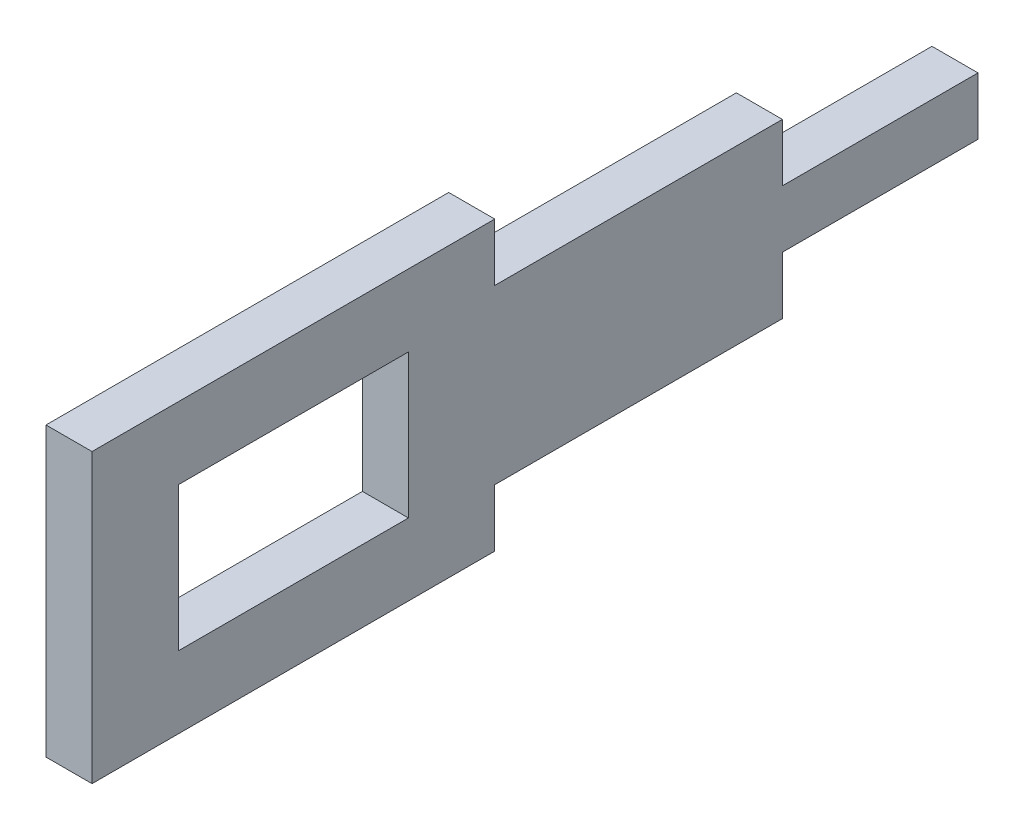
ISO-10303-21;
HEADER;
FILE_DESCRIPTION(('STEP AP214'),'2;1');
FILE_NAME('part.step','',(''),(''),'','','');
FILE_SCHEMA(('AUTOMOTIVE_DESIGN { 1 0 10303 214 1 1 1 1 }'));
ENDSEC;
DATA;
#1=APPLICATION_CONTEXT('core data for automotive mechanical design processes');
#2=APPLICATION_PROTOCOL_DEFINITION('international standard','automotive_design',2000,#1);
#3=PRODUCT_CONTEXT('',#1,'mechanical');
#4=PRODUCT('Part','Part','',(#3));
#5=PRODUCT_RELATED_PRODUCT_CATEGORY('part','',(#4));
#6=PRODUCT_DEFINITION_FORMATION('','',#4);
#7=PRODUCT_DEFINITION_CONTEXT('part definition',#1,'design');
#8=PRODUCT_DEFINITION('design','',#6,#7);
#9=PRODUCT_DEFINITION_SHAPE('','',#8);
#10=(LENGTH_UNIT() NAMED_UNIT(*) SI_UNIT(.MILLI.,.METRE.));
#11=(NAMED_UNIT(*) PLANE_ANGLE_UNIT() SI_UNIT($,.RADIAN.));
#12=(NAMED_UNIT(*) SI_UNIT($,.STERADIAN.) SOLID_ANGLE_UNIT());
#13=UNCERTAINTY_MEASURE_WITH_UNIT(LENGTH_MEASURE(1.E-05),#10,'distance_accuracy_value','');
#14=(GEOMETRIC_REPRESENTATION_CONTEXT(3) GLOBAL_UNCERTAINTY_ASSIGNED_CONTEXT((#13)) GLOBAL_UNIT_ASSIGNED_CONTEXT((#10,
#11,#12)) REPRESENTATION_CONTEXT('',''));
#15=CARTESIAN_POINT('',(0.,0.,0.));
#16=DIRECTION('',(0.,0.,1.));
#17=DIRECTION('',(1.,0.,0.));
#18=AXIS2_PLACEMENT_3D('',#15,#16,#17);
#19=CARTESIAN_POINT('',(167.4250779997,304.6786,9.9));
#20=DIRECTION('',(0.,0.,1.));
#21=DIRECTION('',(1.,0.,0.));
#22=AXIS2_PLACEMENT_3D('',#19,#20,#21);
#23=PLANE('',#22);
#24=DIRECTION('',(0.,1.,0.));
#25=VECTOR('',#24,1.);
#26=CARTESIAN_POINT('',(167.4250779997,302.1786,9.9));
#27=LINE('',#26,#25);
#28=CARTESIAN_POINT('',(167.4250779997,302.1786,9.9));
#29=VERTEX_POINT('',#28);
#30=CARTESIAN_POINT('',(167.4250779997,304.6786,9.9));
#31=VERTEX_POINT('',#30);
#32=EDGE_CURVE('E232',#29,#31,#27,.T.);
#33=ORIENTED_EDGE('',*,*,#32,.T.);
#34=DIRECTION('',(1.,0.,0.));
#35=VECTOR('',#34,1.);
#36=CARTESIAN_POINT('',(166.6250779997,304.6786,9.9));
#37=LINE('',#36,#35);
#38=CARTESIAN_POINT('',(166.6250779997,304.6786,9.9));
#39=VERTEX_POINT('',#38);
#40=EDGE_CURVE('E11',#39,#31,#37,.T.);
#41=ORIENTED_EDGE('',*,*,#40,.F.);
#42=DIRECTION('',(0.,-1.,0.));
#43=VECTOR('',#42,1.);
#44=CARTESIAN_POINT('',(166.6250779997,304.6786,9.9));
#45=LINE('',#44,#43);
#46=CARTESIAN_POINT('',(166.6250779997,302.1786,9.9));
#47=VERTEX_POINT('',#46);
#48=EDGE_CURVE('E124',#39,#47,#45,.T.);
#49=ORIENTED_EDGE('',*,*,#48,.T.);
#50=DIRECTION('',(1.,0.,0.));
#51=VECTOR('',#50,1.);
#52=CARTESIAN_POINT('',(166.6250779997,302.1786,9.9));
#53=LINE('',#52,#51);
#54=EDGE_CURVE('E111',#47,#29,#53,.T.);
#55=ORIENTED_EDGE('',*,*,#54,.T.);
#56=EDGE_LOOP('',(#33,#41,#49,#55));
#57=FACE_BOUND('',#56,.T.);
#58=ADVANCED_FACE('F17',(#57),#23,.T.);
#59=CARTESIAN_POINT('',(167.4250779997,304.6786,13.9));
#60=DIRECTION('',(0.,-1.,0.));
#61=DIRECTION('',(0.,0.,-1.));
#62=AXIS2_PLACEMENT_3D('',#59,#60,#61);
#63=PLANE('',#62);
#64=DIRECTION('',(0.,0.,1.));
#65=VECTOR('',#64,1.);
#66=CARTESIAN_POINT('',(167.4250779997,304.6786,9.9));
#67=LINE('',#66,#65);
#68=CARTESIAN_POINT('',(167.4250779997,304.6786,13.9));
#69=VERTEX_POINT('',#68);
#70=EDGE_CURVE('E235',#31,#69,#67,.T.);
#71=ORIENTED_EDGE('',*,*,#70,.T.);
#72=DIRECTION('',(1.,0.,0.));
#73=VECTOR('',#72,1.);
#74=CARTESIAN_POINT('',(166.6250779997,304.6786,13.9));
#75=LINE('',#74,#73);
#76=CARTESIAN_POINT('',(166.6250779997,304.6786,13.9));
#77=VERTEX_POINT('',#76);
#78=EDGE_CURVE('E26',#77,#69,#75,.T.);
#79=ORIENTED_EDGE('',*,*,#78,.F.);
#80=DIRECTION('',(0.,0.,-1.));
#81=VECTOR('',#80,1.);
#82=CARTESIAN_POINT('',(166.6250779997,304.6786,13.9));
#83=LINE('',#82,#81);
#84=EDGE_CURVE('E20',#77,#39,#83,.T.);
#85=ORIENTED_EDGE('',*,*,#84,.T.);
#86=ORIENTED_EDGE('',*,*,#40,.T.);
#87=EDGE_LOOP('',(#71,#79,#85,#86));
#88=FACE_BOUND('',#87,.T.);
#89=ADVANCED_FACE('F409',(#88),#63,.T.);
#90=CARTESIAN_POINT('',(167.4250779997,302.1786,13.9));
#91=DIRECTION('',(0.,0.,-1.));
#92=DIRECTION('',(0.,-1.,0.));
#93=AXIS2_PLACEMENT_3D('',#90,#91,#92);
#94=PLANE('',#93);
#95=DIRECTION('',(0.,-1.,0.));
#96=VECTOR('',#95,1.);
#97=CARTESIAN_POINT('',(167.4250779997,304.6786,13.9));
#98=LINE('',#97,#96);
#99=CARTESIAN_POINT('',(167.4250779997,302.1786,13.9));
#100=VERTEX_POINT('',#99);
#101=EDGE_CURVE('E236',#69,#100,#98,.T.);
#102=ORIENTED_EDGE('',*,*,#101,.T.);
#103=DIRECTION('',(1.,0.,0.));
#104=VECTOR('',#103,1.);
#105=CARTESIAN_POINT('',(166.6250779997,302.1786,13.9));
#106=LINE('',#105,#104);
#107=CARTESIAN_POINT('',(166.6250779997,302.1786,13.9));
#108=VERTEX_POINT('',#107);
#109=EDGE_CURVE('E120',#108,#100,#106,.T.);
#110=ORIENTED_EDGE('',*,*,#109,.F.);
#111=DIRECTION('',(0.,1.,0.));
#112=VECTOR('',#111,1.);
#113=CARTESIAN_POINT('',(166.6250779997,302.1786,13.9));
#114=LINE('',#113,#112);
#115=EDGE_CURVE('E121',#108,#77,#114,.T.);
#116=ORIENTED_EDGE('',*,*,#115,.T.);
#117=ORIENTED_EDGE('',*,*,#78,.T.);
#118=EDGE_LOOP('',(#102,#110,#116,#117));
#119=FACE_BOUND('',#118,.T.);
#120=ADVANCED_FACE('F414',(#119),#94,.T.);
#121=CARTESIAN_POINT('',(167.4250779997,302.1786,9.9));
#122=DIRECTION('',(0.,1.,0.));
#123=DIRECTION('',(1.,0.,0.));
#124=AXIS2_PLACEMENT_3D('',#121,#122,#123);
#125=PLANE('',#124);
#126=DIRECTION('',(0.,0.,-1.));
#127=VECTOR('',#126,1.);
#128=CARTESIAN_POINT('',(167.4250779997,302.1786,13.9));
#129=LINE('',#128,#127);
#130=EDGE_CURVE('E117',#100,#29,#129,.T.);
#131=ORIENTED_EDGE('',*,*,#130,.T.);
#132=ORIENTED_EDGE('',*,*,#54,.F.);
#133=DIRECTION('',(0.,0.,1.));
#134=VECTOR('',#133,1.);
#135=CARTESIAN_POINT('',(166.6250779997,302.1786,9.9));
#136=LINE('',#135,#134);
#137=EDGE_CURVE('E115',#47,#108,#136,.T.);
#138=ORIENTED_EDGE('',*,*,#137,.T.);
#139=ORIENTED_EDGE('',*,*,#109,.T.);
#140=EDGE_LOOP('',(#131,#132,#138,#139));
#141=FACE_BOUND('',#140,.T.);
#142=ADVANCED_FACE('F112',(#141),#125,.T.);
#143=CARTESIAN_POINT('',(166.6250779997,295.8986390804,23.32925697713));
#144=DIRECTION('',(-1.,0.,0.));
#145=DIRECTION('',(0.,0.,1.));
#146=AXIS2_PLACEMENT_3D('',#143,#144,#145);
#147=PLANE('',#146);
#148=ORIENTED_EDGE('',*,*,#137,.F.);
#149=ORIENTED_EDGE('',*,*,#48,.F.);
#150=ORIENTED_EDGE('',*,*,#84,.F.);
#151=ORIENTED_EDGE('',*,*,#115,.F.);
#152=EDGE_LOOP('',(#148,#149,#150,#151));
#153=FACE_BOUND('',#152,.T.);
#154=DIRECTION('',(0.,1.,0.));
#155=VECTOR('',#154,1.);
#156=CARTESIAN_POINT('',(166.6250779997,302.9286,0.));
#157=LINE('',#156,#155);
#158=CARTESIAN_POINT('',(166.6250779997,302.9286,0.));
#159=VERTEX_POINT('',#158);
#160=CARTESIAN_POINT('',(166.6250779997,303.9286,0.));
#161=VERTEX_POINT('',#160);
#162=EDGE_CURVE('E132',#159,#161,#157,.T.);
#163=ORIENTED_EDGE('',*,*,#162,.F.);
#164=DIRECTION('',(0.,0.,-1.));
#165=VECTOR('',#164,1.);
#166=CARTESIAN_POINT('',(166.6250779997,302.9286,3.4));
#167=LINE('',#166,#165);
#168=CARTESIAN_POINT('',(166.6250779997,302.9286,3.4));
#169=VERTEX_POINT('',#168);
#170=EDGE_CURVE('E146',#169,#159,#167,.T.);
#171=ORIENTED_EDGE('',*,*,#170,.F.);
#172=DIRECTION('',(0.,1.,0.));
#173=VECTOR('',#172,1.);
#174=CARTESIAN_POINT('',(166.6250779997,301.9286,3.4));
#175=LINE('',#174,#173);
#176=CARTESIAN_POINT('',(166.6250779997,301.9286,3.4));
#177=VERTEX_POINT('',#176);
#178=EDGE_CURVE('E151',#177,#169,#175,.T.);
#179=ORIENTED_EDGE('',*,*,#178,.F.);
#180=DIRECTION('',(0.,0.,-1.));
#181=VECTOR('',#180,1.);
#182=CARTESIAN_POINT('',(166.6250779997,301.9286,8.4));
#183=LINE('',#182,#181);
#184=CARTESIAN_POINT('',(166.6250779997,301.9286,8.4));
#185=VERTEX_POINT('',#184);
#186=EDGE_CURVE('E159',#185,#177,#183,.T.);
#187=ORIENTED_EDGE('',*,*,#186,.F.);
#188=DIRECTION('',(0.,1.,0.));
#189=VECTOR('',#188,1.);
#190=CARTESIAN_POINT('',(166.6250779997,300.9286,8.4));
#191=LINE('',#190,#189);
#192=CARTESIAN_POINT('',(166.6250779997,300.9286,8.4));
#193=VERTEX_POINT('',#192);
#194=EDGE_CURVE('E167',#193,#185,#191,.T.);
#195=ORIENTED_EDGE('',*,*,#194,.F.);
#196=DIRECTION('',(0.,0.,1.));
#197=VECTOR('',#196,1.);
#198=CARTESIAN_POINT('',(166.6250779997,300.9286,8.4));
#199=LINE('',#198,#197);
#200=CARTESIAN_POINT('',(166.6250779997,300.9286,15.4));
#201=VERTEX_POINT('',#200);
#202=EDGE_CURVE('E177',#193,#201,#199,.T.);
#203=ORIENTED_EDGE('',*,*,#202,.T.);
#204=DIRECTION('',(0.,1.,0.));
#205=VECTOR('',#204,1.);
#206=CARTESIAN_POINT('',(166.6250779997,300.9286,15.4));
#207=LINE('',#206,#205);
#208=CARTESIAN_POINT('',(166.6250779997,305.9286,15.4));
#209=VERTEX_POINT('',#208);
#210=EDGE_CURVE('E184',#201,#209,#207,.T.);
#211=ORIENTED_EDGE('',*,*,#210,.T.);
#212=DIRECTION('',(0.,0.,-1.));
#213=VECTOR('',#212,1.);
#214=CARTESIAN_POINT('',(166.6250779997,305.9286,15.4));
#215=LINE('',#214,#213);
#216=CARTESIAN_POINT('',(166.6250779997,305.9286,8.4));
#217=VERTEX_POINT('',#216);
#218=EDGE_CURVE('E191',#209,#217,#215,.T.);
#219=ORIENTED_EDGE('',*,*,#218,.T.);
#220=DIRECTION('',(0.,-1.,0.));
#221=VECTOR('',#220,1.);
#222=CARTESIAN_POINT('',(166.6250779997,305.9286,8.4));
#223=LINE('',#222,#221);
#224=CARTESIAN_POINT('',(166.6250779997,304.9286,8.4));
#225=VERTEX_POINT('',#224);
#226=EDGE_CURVE('E196',#217,#225,#223,.T.);
#227=ORIENTED_EDGE('',*,*,#226,.T.);
#228=DIRECTION('',(0.,0.,-1.));
#229=VECTOR('',#228,1.);
#230=CARTESIAN_POINT('',(166.6250779997,304.9286,8.4));
#231=LINE('',#230,#229);
#232=CARTESIAN_POINT('',(166.6250779997,304.9286,3.4));
#233=VERTEX_POINT('',#232);
#234=EDGE_CURVE('E205',#225,#233,#231,.T.);
#235=ORIENTED_EDGE('',*,*,#234,.T.);
#236=DIRECTION('',(0.,-1.,0.));
#237=VECTOR('',#236,1.);
#238=CARTESIAN_POINT('',(166.6250779997,304.9286,3.4));
#239=LINE('',#238,#237);
#240=CARTESIAN_POINT('',(166.6250779997,303.9286,3.4));
#241=VERTEX_POINT('',#240);
#242=EDGE_CURVE('E215',#233,#241,#239,.T.);
#243=ORIENTED_EDGE('',*,*,#242,.T.);
#244=DIRECTION('',(0.,0.,-1.));
#245=VECTOR('',#244,1.);
#246=CARTESIAN_POINT('',(166.6250779997,303.9286,3.4));
#247=LINE('',#246,#245);
#248=EDGE_CURVE('E222',#241,#161,#247,.T.);
#249=ORIENTED_EDGE('',*,*,#248,.T.);
#250=EDGE_LOOP('',(#163,#171,#179,#187,#195,#203,#211,#219,#227,#235,#243,#249));
#251=FACE_BOUND('',#250,.T.);
#252=ADVANCED_FACE('F129',(#153,#251),#147,.T.);
#253=CARTESIAN_POINT('',(167.4250779997,302.9286,0.));
#254=DIRECTION('',(0.,0.,-1.));
#255=DIRECTION('',(0.,-1.,0.));
#256=AXIS2_PLACEMENT_3D('',#253,#254,#255);
#257=PLANE('',#256);
#258=DIRECTION('',(0.,-1.,0.));
#259=VECTOR('',#258,1.);
#260=CARTESIAN_POINT('',(167.4250779997,303.9286,0.));
#261=LINE('',#260,#259);
#262=CARTESIAN_POINT('',(167.4250779997,303.9286,0.));
#263=VERTEX_POINT('',#262);
#264=CARTESIAN_POINT('',(167.4250779997,302.9286,0.));
#265=VERTEX_POINT('',#264);
#266=EDGE_CURVE('E240',#263,#265,#261,.T.);
#267=ORIENTED_EDGE('',*,*,#266,.T.);
#268=DIRECTION('',(1.,0.,0.));
#269=VECTOR('',#268,1.);
#270=CARTESIAN_POINT('',(166.6250779997,302.9286,0.));
#271=LINE('',#270,#269);
#272=EDGE_CURVE('E138',#159,#265,#271,.T.);
#273=ORIENTED_EDGE('',*,*,#272,.F.);
#274=ORIENTED_EDGE('',*,*,#162,.T.);
#275=DIRECTION('',(1.,0.,0.));
#276=VECTOR('',#275,1.);
#277=CARTESIAN_POINT('',(166.6250779997,303.9286,0.));
#278=LINE('',#277,#276);
#279=EDGE_CURVE('E226',#161,#263,#278,.T.);
#280=ORIENTED_EDGE('',*,*,#279,.T.);
#281=EDGE_LOOP('',(#267,#273,#274,#280));
#282=FACE_BOUND('',#281,.T.);
#283=ADVANCED_FACE('F356',(#282),#257,.T.);
#284=CARTESIAN_POINT('',(167.4250779997,302.9286,3.4));
#285=DIRECTION('',(0.,-1.,0.));
#286=DIRECTION('',(0.,0.,-1.));
#287=AXIS2_PLACEMENT_3D('',#284,#285,#286);
#288=PLANE('',#287);
#289=DIRECTION('',(0.,0.,1.));
#290=VECTOR('',#289,1.);
#291=CARTESIAN_POINT('',(167.4250779997,302.9286,0.));
#292=LINE('',#291,#290);
#293=CARTESIAN_POINT('',(167.4250779997,302.9286,3.4));
#294=VERTEX_POINT('',#293);
#295=EDGE_CURVE('E244',#265,#294,#292,.T.);
#296=ORIENTED_EDGE('',*,*,#295,.T.);
#297=DIRECTION('',(1.,0.,0.));
#298=VECTOR('',#297,1.);
#299=CARTESIAN_POINT('',(166.6250779997,302.9286,3.4));
#300=LINE('',#299,#298);
#301=EDGE_CURVE('E150',#169,#294,#300,.T.);
#302=ORIENTED_EDGE('',*,*,#301,.F.);
#303=ORIENTED_EDGE('',*,*,#170,.T.);
#304=ORIENTED_EDGE('',*,*,#272,.T.);
#305=EDGE_LOOP('',(#296,#302,#303,#304));
#306=FACE_BOUND('',#305,.T.);
#307=ADVANCED_FACE('F351',(#306),#288,.T.);
#308=CARTESIAN_POINT('',(167.4250779997,301.9286,3.4));
#309=DIRECTION('',(0.,0.,-1.));
#310=DIRECTION('',(0.,-1.,0.));
#311=AXIS2_PLACEMENT_3D('',#308,#309,#310);
#312=PLANE('',#311);
#313=DIRECTION('',(0.,-1.,0.));
#314=VECTOR('',#313,1.);
#315=CARTESIAN_POINT('',(167.4250779997,302.9286,3.4));
#316=LINE('',#315,#314);
#317=CARTESIAN_POINT('',(167.4250779997,301.9286,3.4));
#318=VERTEX_POINT('',#317);
#319=EDGE_CURVE('E245',#294,#318,#316,.T.);
#320=ORIENTED_EDGE('',*,*,#319,.T.);
#321=DIRECTION('',(1.,0.,0.));
#322=VECTOR('',#321,1.);
#323=CARTESIAN_POINT('',(166.6250779997,301.9286,3.4));
#324=LINE('',#323,#322);
#325=EDGE_CURVE('E155',#177,#318,#324,.T.);
#326=ORIENTED_EDGE('',*,*,#325,.F.);
#327=ORIENTED_EDGE('',*,*,#178,.T.);
#328=ORIENTED_EDGE('',*,*,#301,.T.);
#329=EDGE_LOOP('',(#320,#326,#327,#328));
#330=FACE_BOUND('',#329,.T.);
#331=ADVANCED_FACE('F359',(#330),#312,.T.);
#332=CARTESIAN_POINT('',(167.4250779997,301.9286,8.4));
#333=DIRECTION('',(0.,-1.,0.));
#334=DIRECTION('',(0.,0.,-1.));
#335=AXIS2_PLACEMENT_3D('',#332,#333,#334);
#336=PLANE('',#335);
#337=DIRECTION('',(0.,0.,1.));
#338=VECTOR('',#337,1.);
#339=CARTESIAN_POINT('',(167.4250779997,301.9286,3.4));
#340=LINE('',#339,#338);
#341=CARTESIAN_POINT('',(167.4250779997,301.9286,8.4));
#342=VERTEX_POINT('',#341);
#343=EDGE_CURVE('E249',#318,#342,#340,.T.);
#344=ORIENTED_EDGE('',*,*,#343,.T.);
#345=DIRECTION('',(1.,0.,0.));
#346=VECTOR('',#345,1.);
#347=CARTESIAN_POINT('',(166.6250779997,301.9286,8.4));
#348=LINE('',#347,#346);
#349=EDGE_CURVE('E163',#185,#342,#348,.T.);
#350=ORIENTED_EDGE('',*,*,#349,.F.);
#351=ORIENTED_EDGE('',*,*,#186,.T.);
#352=ORIENTED_EDGE('',*,*,#325,.T.);
#353=EDGE_LOOP('',(#344,#350,#351,#352));
#354=FACE_BOUND('',#353,.T.);
#355=ADVANCED_FACE('F298',(#354),#336,.T.);
#356=CARTESIAN_POINT('',(167.4250779997,300.9286,8.4));
#357=DIRECTION('',(0.,0.,-1.));
#358=DIRECTION('',(0.,-1.,0.));
#359=AXIS2_PLACEMENT_3D('',#356,#357,#358);
#360=PLANE('',#359);
#361=DIRECTION('',(0.,-1.,0.));
#362=VECTOR('',#361,1.);
#363=CARTESIAN_POINT('',(167.4250779997,301.9286,8.4));
#364=LINE('',#363,#362);
#365=CARTESIAN_POINT('',(167.4250779997,300.9286,8.4));
#366=VERTEX_POINT('',#365);
#367=EDGE_CURVE('E250',#342,#366,#364,.T.);
#368=ORIENTED_EDGE('',*,*,#367,.T.);
#369=DIRECTION('',(1.,0.,0.));
#370=VECTOR('',#369,1.);
#371=CARTESIAN_POINT('',(166.6250779997,300.9286,8.4));
#372=LINE('',#371,#370);
#373=EDGE_CURVE('E173',#193,#366,#372,.T.);
#374=ORIENTED_EDGE('',*,*,#373,.F.);
#375=ORIENTED_EDGE('',*,*,#194,.T.);
#376=ORIENTED_EDGE('',*,*,#349,.T.);
#377=EDGE_LOOP('',(#368,#374,#375,#376));
#378=FACE_BOUND('',#377,.T.);
#379=ADVANCED_FACE('F312',(#378),#360,.T.);
#380=CARTESIAN_POINT('',(167.4250779997,300.9286,15.4));
#381=DIRECTION('',(0.,-1.,0.));
#382=DIRECTION('',(0.,0.,-1.));
#383=AXIS2_PLACEMENT_3D('',#380,#381,#382);
#384=PLANE('',#383);
#385=DIRECTION('',(0.,0.,1.));
#386=VECTOR('',#385,1.);
#387=CARTESIAN_POINT('',(167.4250779997,300.9286,8.4));
#388=LINE('',#387,#386);
#389=CARTESIAN_POINT('',(167.4250779997,300.9286,15.4));
#390=VERTEX_POINT('',#389);
#391=EDGE_CURVE('E254',#366,#390,#388,.T.);
#392=ORIENTED_EDGE('',*,*,#391,.T.);
#393=DIRECTION('',(1.,0.,0.));
#394=VECTOR('',#393,1.);
#395=CARTESIAN_POINT('',(166.6250779997,300.9286,15.4));
#396=LINE('',#395,#394);
#397=EDGE_CURVE('E180',#201,#390,#396,.T.);
#398=ORIENTED_EDGE('',*,*,#397,.F.);
#399=ORIENTED_EDGE('',*,*,#202,.F.);
#400=ORIENTED_EDGE('',*,*,#373,.T.);
#401=EDGE_LOOP('',(#392,#398,#399,#400));
#402=FACE_BOUND('',#401,.T.);
#403=ADVANCED_FACE('F395',(#402),#384,.T.);
#404=CARTESIAN_POINT('',(167.4250779997,305.9286,15.4));
#405=DIRECTION('',(0.,0.,1.));
#406=DIRECTION('',(1.,0.,0.));
#407=AXIS2_PLACEMENT_3D('',#404,#405,#406);
#408=PLANE('',#407);
#409=DIRECTION('',(0.,1.,0.));
#410=VECTOR('',#409,1.);
#411=CARTESIAN_POINT('',(167.4250779997,300.9286,15.4));
#412=LINE('',#411,#410);
#413=CARTESIAN_POINT('',(167.4250779997,305.9286,15.4));
#414=VERTEX_POINT('',#413);
#415=EDGE_CURVE('E258',#390,#414,#412,.T.);
#416=ORIENTED_EDGE('',*,*,#415,.T.);
#417=DIRECTION('',(1.,0.,0.));
#418=VECTOR('',#417,1.);
#419=CARTESIAN_POINT('',(166.6250779997,305.9286,15.4));
#420=LINE('',#419,#418);
#421=EDGE_CURVE('E187',#209,#414,#420,.T.);
#422=ORIENTED_EDGE('',*,*,#421,.F.);
#423=ORIENTED_EDGE('',*,*,#210,.F.);
#424=ORIENTED_EDGE('',*,*,#397,.T.);
#425=EDGE_LOOP('',(#416,#422,#423,#424));
#426=FACE_BOUND('',#425,.T.);
#427=ADVANCED_FACE('F393',(#426),#408,.T.);
#428=CARTESIAN_POINT('',(167.4250779997,305.9286,8.4));
#429=DIRECTION('',(0.,1.,0.));
#430=DIRECTION('',(1.,0.,0.));
#431=AXIS2_PLACEMENT_3D('',#428,#429,#430);
#432=PLANE('',#431);
#433=DIRECTION('',(0.,0.,-1.));
#434=VECTOR('',#433,1.);
#435=CARTESIAN_POINT('',(167.4250779997,305.9286,15.4));
#436=LINE('',#435,#434);
#437=CARTESIAN_POINT('',(167.4250779997,305.9286,8.4));
#438=VERTEX_POINT('',#437);
#439=EDGE_CURVE('E262',#414,#438,#436,.T.);
#440=ORIENTED_EDGE('',*,*,#439,.T.);
#441=DIRECTION('',(1.,0.,0.));
#442=VECTOR('',#441,1.);
#443=CARTESIAN_POINT('',(166.6250779997,305.9286,8.4));
#444=LINE('',#443,#442);
#445=EDGE_CURVE('E192',#217,#438,#444,.T.);
#446=ORIENTED_EDGE('',*,*,#445,.F.);
#447=ORIENTED_EDGE('',*,*,#218,.F.);
#448=ORIENTED_EDGE('',*,*,#421,.T.);
#449=EDGE_LOOP('',(#440,#446,#447,#448));
#450=FACE_BOUND('',#449,.T.);
#451=ADVANCED_FACE('F389',(#450),#432,.T.);
#452=CARTESIAN_POINT('',(167.4250779997,304.9286,8.4));
#453=DIRECTION('',(0.,0.,-1.));
#454=DIRECTION('',(0.,-1.,0.));
#455=AXIS2_PLACEMENT_3D('',#452,#453,#454);
#456=PLANE('',#455);
#457=DIRECTION('',(0.,-1.,0.));
#458=VECTOR('',#457,1.);
#459=CARTESIAN_POINT('',(167.4250779997,305.9286,8.4));
#460=LINE('',#459,#458);
#461=CARTESIAN_POINT('',(167.4250779997,304.9286,8.4));
#462=VERTEX_POINT('',#461);
#463=EDGE_CURVE('E265',#438,#462,#460,.T.);
#464=ORIENTED_EDGE('',*,*,#463,.T.);
#465=DIRECTION('',(1.,0.,0.));
#466=VECTOR('',#465,1.);
#467=CARTESIAN_POINT('',(166.6250779997,304.9286,8.4));
#468=LINE('',#467,#466);
#469=EDGE_CURVE('E201',#225,#462,#468,.T.);
#470=ORIENTED_EDGE('',*,*,#469,.F.);
#471=ORIENTED_EDGE('',*,*,#226,.F.);
#472=ORIENTED_EDGE('',*,*,#445,.T.);
#473=EDGE_LOOP('',(#464,#470,#471,#472));
#474=FACE_BOUND('',#473,.T.);
#475=ADVANCED_FACE('F384',(#474),#456,.T.);
#476=CARTESIAN_POINT('',(167.4250779997,304.9286,3.4));
#477=DIRECTION('',(0.,1.,0.));
#478=DIRECTION('',(1.,0.,0.));
#479=AXIS2_PLACEMENT_3D('',#476,#477,#478);
#480=PLANE('',#479);
#481=DIRECTION('',(0.,0.,-1.));
#482=VECTOR('',#481,1.);
#483=CARTESIAN_POINT('',(167.4250779997,304.9286,8.4));
#484=LINE('',#483,#482);
#485=CARTESIAN_POINT('',(167.4250779997,304.9286,3.4));
#486=VERTEX_POINT('',#485);
#487=EDGE_CURVE('E269',#462,#486,#484,.T.);
#488=ORIENTED_EDGE('',*,*,#487,.T.);
#489=DIRECTION('',(1.,0.,0.));
#490=VECTOR('',#489,1.);
#491=CARTESIAN_POINT('',(166.6250779997,304.9286,3.4));
#492=LINE('',#491,#490);
#493=EDGE_CURVE('E211',#233,#486,#492,.T.);
#494=ORIENTED_EDGE('',*,*,#493,.F.);
#495=ORIENTED_EDGE('',*,*,#234,.F.);
#496=ORIENTED_EDGE('',*,*,#469,.T.);
#497=EDGE_LOOP('',(#488,#494,#495,#496));
#498=FACE_BOUND('',#497,.T.);
#499=ADVANCED_FACE('F379',(#498),#480,.T.);
#500=CARTESIAN_POINT('',(167.4250779997,303.9286,3.4));
#501=DIRECTION('',(0.,0.,-1.));
#502=DIRECTION('',(0.,-1.,0.));
#503=AXIS2_PLACEMENT_3D('',#500,#501,#502);
#504=PLANE('',#503);
#505=DIRECTION('',(0.,-1.,0.));
#506=VECTOR('',#505,1.);
#507=CARTESIAN_POINT('',(167.4250779997,304.9286,3.4));
#508=LINE('',#507,#506);
#509=CARTESIAN_POINT('',(167.4250779997,303.9286,3.4));
#510=VERTEX_POINT('',#509);
#511=EDGE_CURVE('E273',#486,#510,#508,.T.);
#512=ORIENTED_EDGE('',*,*,#511,.T.);
#513=DIRECTION('',(1.,0.,0.));
#514=VECTOR('',#513,1.);
#515=CARTESIAN_POINT('',(166.6250779997,303.9286,3.4));
#516=LINE('',#515,#514);
#517=EDGE_CURVE('E218',#241,#510,#516,.T.);
#518=ORIENTED_EDGE('',*,*,#517,.F.);
#519=ORIENTED_EDGE('',*,*,#242,.F.);
#520=ORIENTED_EDGE('',*,*,#493,.T.);
#521=EDGE_LOOP('',(#512,#518,#519,#520));
#522=FACE_BOUND('',#521,.T.);
#523=ADVANCED_FACE('F376',(#522),#504,.T.);
#524=CARTESIAN_POINT('',(167.4250779997,303.9286,0.));
#525=DIRECTION('',(0.,1.,0.));
#526=DIRECTION('',(1.,0.,0.));
#527=AXIS2_PLACEMENT_3D('',#524,#525,#526);
#528=PLANE('',#527);
#529=DIRECTION('',(0.,0.,-1.));
#530=VECTOR('',#529,1.);
#531=CARTESIAN_POINT('',(167.4250779997,303.9286,3.4));
#532=LINE('',#531,#530);
#533=EDGE_CURVE('E277',#510,#263,#532,.T.);
#534=ORIENTED_EDGE('',*,*,#533,.T.);
#535=ORIENTED_EDGE('',*,*,#279,.F.);
#536=ORIENTED_EDGE('',*,*,#248,.F.);
#537=ORIENTED_EDGE('',*,*,#517,.T.);
#538=EDGE_LOOP('',(#534,#535,#536,#537));
#539=FACE_BOUND('',#538,.T.);
#540=ADVANCED_FACE('F364',(#539),#528,.T.);
#541=CARTESIAN_POINT('',(167.4250779997,295.8986390804,23.32925697713));
#542=DIRECTION('',(-1.,0.,0.));
#543=DIRECTION('',(0.,0.,1.));
#544=AXIS2_PLACEMENT_3D('',#541,#542,#543);
#545=PLANE('',#544);
#546=ORIENTED_EDGE('',*,*,#101,.F.);
#547=ORIENTED_EDGE('',*,*,#70,.F.);
#548=ORIENTED_EDGE('',*,*,#32,.F.);
#549=ORIENTED_EDGE('',*,*,#130,.F.);
#550=EDGE_LOOP('',(#546,#547,#548,#549));
#551=FACE_BOUND('',#550,.T.);
#552=ORIENTED_EDGE('',*,*,#533,.F.);
#553=ORIENTED_EDGE('',*,*,#511,.F.);
#554=ORIENTED_EDGE('',*,*,#487,.F.);
#555=ORIENTED_EDGE('',*,*,#463,.F.);
#556=ORIENTED_EDGE('',*,*,#439,.F.);
#557=ORIENTED_EDGE('',*,*,#415,.F.);
#558=ORIENTED_EDGE('',*,*,#391,.F.);
#559=ORIENTED_EDGE('',*,*,#367,.F.);
#560=ORIENTED_EDGE('',*,*,#343,.F.);
#561=ORIENTED_EDGE('',*,*,#319,.F.);
#562=ORIENTED_EDGE('',*,*,#295,.F.);
#563=ORIENTED_EDGE('',*,*,#266,.F.);
#564=EDGE_LOOP('',(#552,#553,#554,#555,#556,#557,#558,#559,#560,#561,#562,#563));
#565=FACE_BOUND('',#564,.T.);
#566=ADVANCED_FACE('F308',(#551,#565),#545,.F.);
#567=CLOSED_SHELL('',(#58,#89,#120,#142,#252,#283,#307,#331,#355,#379,#403,#427,#451,#475,#499,
#523,#540,#566));
#568=MANIFOLD_SOLID_BREP('B1',#567);
#569=ADVANCED_BREP_SHAPE_REPRESENTATION('',(#18,#568),#14);
#570=SHAPE_DEFINITION_REPRESENTATION(#9,#569);
ENDSEC;
END-ISO-10303-21;
